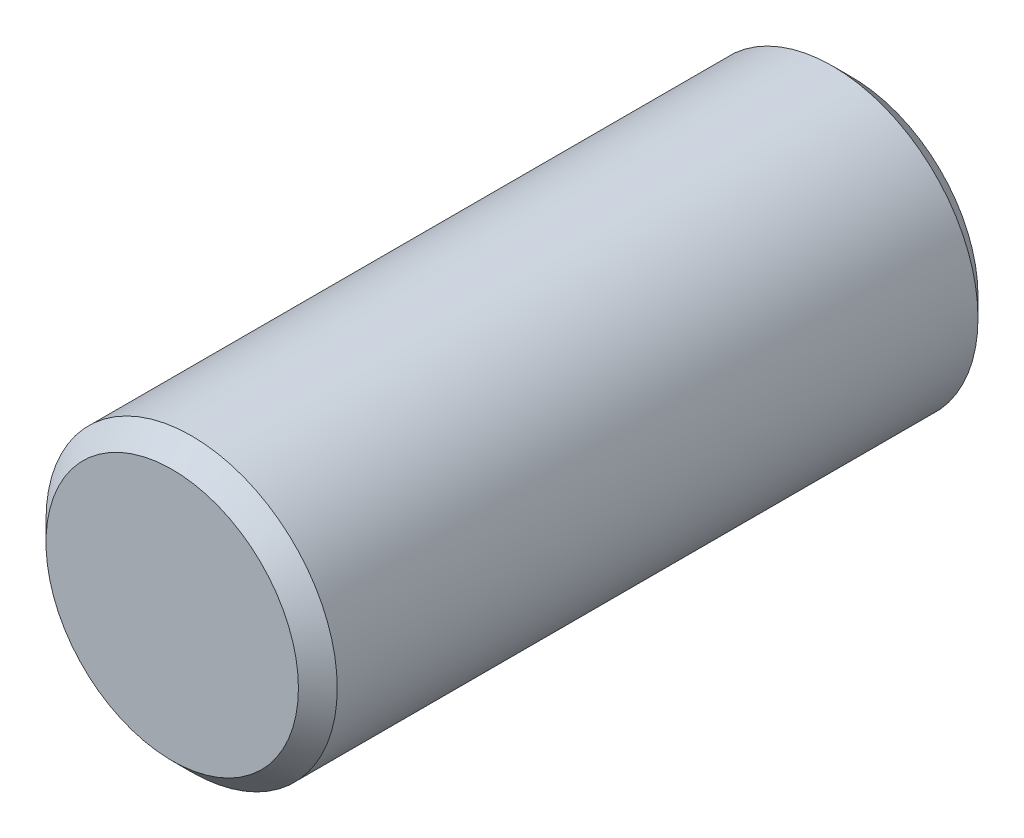
ISO-10303-21;
HEADER;
FILE_DESCRIPTION(('STEP AP214'),'2;1');
FILE_NAME('part.step','',(''),(''),'','','');
FILE_SCHEMA(('AUTOMOTIVE_DESIGN { 1 0 10303 214 1 1 1 1 }'));
ENDSEC;
DATA;
#1=APPLICATION_CONTEXT('core data for automotive mechanical design processes');
#2=APPLICATION_PROTOCOL_DEFINITION('international standard','automotive_design',2000,#1);
#3=PRODUCT_CONTEXT('',#1,'mechanical');
#4=PRODUCT('Part','Part','',(#3));
#5=PRODUCT_RELATED_PRODUCT_CATEGORY('part','',(#4));
#6=PRODUCT_DEFINITION_FORMATION('','',#4);
#7=PRODUCT_DEFINITION_CONTEXT('part definition',#1,'design');
#8=PRODUCT_DEFINITION('design','',#6,#7);
#9=PRODUCT_DEFINITION_SHAPE('','',#8);
#10=(LENGTH_UNIT() NAMED_UNIT(*) SI_UNIT(.MILLI.,.METRE.));
#11=(NAMED_UNIT(*) PLANE_ANGLE_UNIT() SI_UNIT($,.RADIAN.));
#12=(NAMED_UNIT(*) SI_UNIT($,.STERADIAN.) SOLID_ANGLE_UNIT());
#13=UNCERTAINTY_MEASURE_WITH_UNIT(LENGTH_MEASURE(1.E-05),#10,'distance_accuracy_value','');
#14=(GEOMETRIC_REPRESENTATION_CONTEXT(3) GLOBAL_UNCERTAINTY_ASSIGNED_CONTEXT((#13)) GLOBAL_UNIT_ASSIGNED_CONTEXT((#10,
#11,#12)) REPRESENTATION_CONTEXT('',''));
#15=CARTESIAN_POINT('',(0.,0.,0.));
#16=DIRECTION('',(0.,0.,1.));
#17=DIRECTION('',(1.,0.,0.));
#18=AXIS2_PLACEMENT_3D('',#15,#16,#17);
#19=CARTESIAN_POINT('',(0.,0.,3.5));
#20=DIRECTION('',(0.,0.,-1.));
#21=DIRECTION('',(-1.,0.,0.));
#22=AXIS2_PLACEMENT_3D('',#19,#20,#21);
#23=CYLINDRICAL_SURFACE('',#22,1.5);
#24=CARTESIAN_POINT('',(0.,0.,-3.3));
#25=DIRECTION('',(0.,0.,1.));
#26=DIRECTION('',(1.,0.,0.));
#27=AXIS2_PLACEMENT_3D('',#24,#25,#26);
#28=CIRCLE('',#27,1.5);
#29=CARTESIAN_POINT('',(1.5,0.,-3.3));
#30=VERTEX_POINT('',#29);
#31=EDGE_CURVE('E55',#30,#30,#28,.T.);
#32=ORIENTED_EDGE('',*,*,#31,.T.);
#33=EDGE_LOOP('',(#32));
#34=FACE_BOUND('',#33,.T.);
#35=CARTESIAN_POINT('',(0.,0.,3.3));
#36=DIRECTION('',(0.,0.,1.));
#37=DIRECTION('',(1.,0.,0.));
#38=AXIS2_PLACEMENT_3D('',#35,#36,#37);
#39=CIRCLE('',#38,1.5);
#40=CARTESIAN_POINT('',(1.5,0.,3.3));
#41=VERTEX_POINT('',#40);
#42=EDGE_CURVE('E59',#41,#41,#39,.F.);
#43=ORIENTED_EDGE('',*,*,#42,.T.);
#44=EDGE_LOOP('',(#43));
#45=FACE_BOUND('',#44,.T.);
#46=ADVANCED_FACE('F43',(#34,#45),#23,.T.);
#47=CARTESIAN_POINT('',(0.,0.,3.5));
#48=DIRECTION('',(0.,0.,1.));
#49=DIRECTION('',(1.,0.,0.));
#50=AXIS2_PLACEMENT_3D('',#47,#48,#49);
#51=PLANE('',#50);
#52=CARTESIAN_POINT('',(0.,0.,3.5));
#53=DIRECTION('',(0.,0.,1.));
#54=DIRECTION('',(1.,0.,0.));
#55=AXIS2_PLACEMENT_3D('',#52,#53,#54);
#56=CIRCLE('',#55,1.3);
#57=CARTESIAN_POINT('',(1.3,0.,3.5));
#58=VERTEX_POINT('',#57);
#59=EDGE_CURVE('E10',#58,#58,#56,.T.);
#60=ORIENTED_EDGE('',*,*,#59,.T.);
#61=EDGE_LOOP('',(#60));
#62=FACE_BOUND('',#61,.T.);
#63=ADVANCED_FACE('F75',(#62),#51,.T.);
#64=CARTESIAN_POINT('',(0.,0.,-3.5));
#65=DIRECTION('',(0.,0.,1.));
#66=DIRECTION('',(1.,0.,0.));
#67=AXIS2_PLACEMENT_3D('',#64,#65,#66);
#68=PLANE('',#67);
#69=CARTESIAN_POINT('',(0.,0.,-3.5));
#70=DIRECTION('',(0.,0.,1.));
#71=DIRECTION('',(1.,0.,0.));
#72=AXIS2_PLACEMENT_3D('',#69,#70,#71);
#73=CIRCLE('',#72,1.3);
#74=CARTESIAN_POINT('',(1.3,0.,-3.5));
#75=VERTEX_POINT('',#74);
#76=EDGE_CURVE('E51',#75,#75,#73,.F.);
#77=ORIENTED_EDGE('',*,*,#76,.T.);
#78=EDGE_LOOP('',(#77));
#79=FACE_BOUND('',#78,.T.);
#80=ADVANCED_FACE('F72',(#79),#68,.F.);
#81=CARTESIAN_POINT('',(0.,0.,-3.3));
#82=DIRECTION('',(0.,0.,1.));
#83=DIRECTION('',(1.,0.,0.));
#84=AXIS2_PLACEMENT_3D('',#81,#82,#83);
#85=CONICAL_SURFACE('',#84,1.5,0.785398163397452);
#86=ORIENTED_EDGE('',*,*,#76,.F.);
#87=EDGE_LOOP('',(#86));
#88=FACE_BOUND('',#87,.T.);
#89=ORIENTED_EDGE('',*,*,#31,.F.);
#90=EDGE_LOOP('',(#89));
#91=FACE_BOUND('',#90,.T.);
#92=ADVANCED_FACE('F68',(#88,#91),#85,.T.);
#93=CARTESIAN_POINT('',(0.,0.,3.5));
#94=DIRECTION('',(0.,0.,-1.));
#95=DIRECTION('',(-1.,0.,0.));
#96=AXIS2_PLACEMENT_3D('',#93,#94,#95);
#97=CONICAL_SURFACE('',#96,1.3,0.785398163397446);
#98=ORIENTED_EDGE('',*,*,#42,.F.);
#99=EDGE_LOOP('',(#98));
#100=FACE_BOUND('',#99,.T.);
#101=ORIENTED_EDGE('',*,*,#59,.F.);
#102=EDGE_LOOP('',(#101));
#103=FACE_BOUND('',#102,.T.);
#104=ADVANCED_FACE('F46',(#100,#103),#97,.T.);
#105=CLOSED_SHELL('',(#46,#63,#80,#92,#104));
#106=MANIFOLD_SOLID_BREP('B2',#105);
#107=ADVANCED_BREP_SHAPE_REPRESENTATION('',(#18,#106),#14);
#108=SHAPE_DEFINITION_REPRESENTATION(#9,#107);
ENDSEC;
END-ISO-10303-21;
